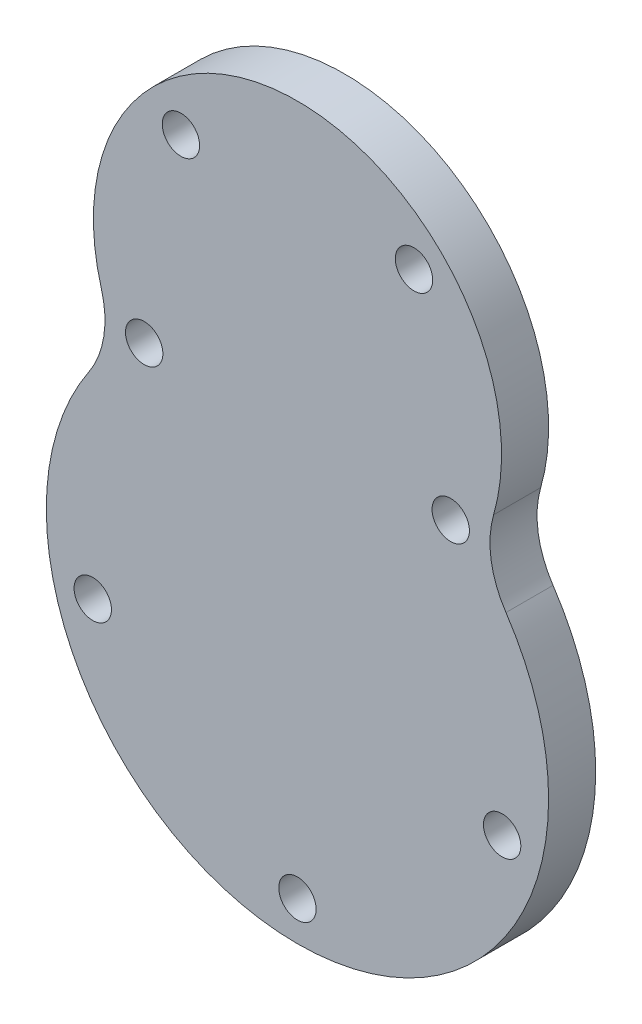
ISO-10303-21;
HEADER;
FILE_DESCRIPTION(('STEP AP214'),'2;1');
FILE_NAME('part.step','',(''),(''),'','','');
FILE_SCHEMA(('AUTOMOTIVE_DESIGN { 1 0 10303 214 1 1 1 1 }'));
ENDSEC;
DATA;
#1=APPLICATION_CONTEXT('core data for automotive mechanical design processes');
#2=APPLICATION_PROTOCOL_DEFINITION('international standard','automotive_design',2000,#1);
#3=PRODUCT_CONTEXT('',#1,'mechanical');
#4=PRODUCT('Part','Part','',(#3));
#5=PRODUCT_RELATED_PRODUCT_CATEGORY('part','',(#4));
#6=PRODUCT_DEFINITION_FORMATION('','',#4);
#7=PRODUCT_DEFINITION_CONTEXT('part definition',#1,'design');
#8=PRODUCT_DEFINITION('design','',#6,#7);
#9=PRODUCT_DEFINITION_SHAPE('','',#8);
#10=(LENGTH_UNIT() NAMED_UNIT(*) SI_UNIT(.MILLI.,.METRE.));
#11=(NAMED_UNIT(*) PLANE_ANGLE_UNIT() SI_UNIT($,.RADIAN.));
#12=(NAMED_UNIT(*) SI_UNIT($,.STERADIAN.) SOLID_ANGLE_UNIT());
#13=UNCERTAINTY_MEASURE_WITH_UNIT(LENGTH_MEASURE(1.E-05),#10,'distance_accuracy_value','');
#14=(GEOMETRIC_REPRESENTATION_CONTEXT(3) GLOBAL_UNCERTAINTY_ASSIGNED_CONTEXT((#13)) GLOBAL_UNIT_ASSIGNED_CONTEXT((#10,
#11,#12)) REPRESENTATION_CONTEXT('',''));
#15=CARTESIAN_POINT('',(0.,0.,0.));
#16=DIRECTION('',(0.,0.,1.));
#17=DIRECTION('',(1.,0.,0.));
#18=AXIS2_PLACEMENT_3D('',#15,#16,#17);
#19=CARTESIAN_POINT('',(36.528744622194,-10.4714285714286,6.));
#20=DIRECTION('',(0.,0.,-1.));
#21=DIRECTION('',(-1.,0.,0.));
#22=AXIS2_PLACEMENT_3D('',#19,#20,#21);
#23=CYLINDRICAL_SURFACE('',#22,12.);
#24=CARTESIAN_POINT('',(36.528744622194,-10.4714285714286,0.));
#25=DIRECTION('',(0.,0.,-1.));
#26=DIRECTION('',(1.,0.,0.));
#27=AXIS2_PLACEMENT_3D('',#24,#25,#26);
#28=CIRCLE('',#27,12.);
#29=CARTESIAN_POINT('',(26.566359725232,-17.161038961039,0.));
#30=VERTEX_POINT('',#29);
#31=CARTESIAN_POINT('',(24.9933515836064,-7.16466165413534,0.));
#32=VERTEX_POINT('',#31);
#33=EDGE_CURVE('E112',#30,#32,#28,.T.);
#34=ORIENTED_EDGE('',*,*,#33,.T.);
#35=DIRECTION('',(0.,0.,-1.));
#36=VECTOR('',#35,1.);
#37=CARTESIAN_POINT('',(24.9933515836064,-7.16466165413534,6.));
#38=LINE('',#37,#36);
#39=CARTESIAN_POINT('',(24.9933515836064,-7.16466165413534,6.));
#40=VERTEX_POINT('',#39);
#41=EDGE_CURVE('E11',#40,#32,#38,.T.);
#42=ORIENTED_EDGE('',*,*,#41,.F.);
#43=CARTESIAN_POINT('',(36.528744622194,-10.4714285714286,6.));
#44=DIRECTION('',(0.,0.,-1.));
#45=DIRECTION('',(1.,0.,0.));
#46=AXIS2_PLACEMENT_3D('',#43,#44,#45);
#47=CIRCLE('',#46,12.);
#48=CARTESIAN_POINT('',(26.566359725232,-17.161038961039,6.));
#49=VERTEX_POINT('',#48);
#50=EDGE_CURVE('E96',#49,#40,#47,.T.);
#51=ORIENTED_EDGE('',*,*,#50,.F.);
#52=DIRECTION('',(0.,0.,-1.));
#53=VECTOR('',#52,1.);
#54=CARTESIAN_POINT('',(26.566359725232,-17.161038961039,6.));
#55=LINE('',#54,#53);
#56=EDGE_CURVE('E108',#49,#30,#55,.T.);
#57=ORIENTED_EDGE('',*,*,#56,.T.);
#58=EDGE_LOOP('',(#34,#42,#51,#57));
#59=FACE_BOUND('',#58,.T.);
#60=ADVANCED_FACE('F44',(#59),#23,.F.);
#61=CARTESIAN_POINT('',(0.,0.,6.));
#62=DIRECTION('',(0.,0.,-1.));
#63=DIRECTION('',(-1.,0.,0.));
#64=AXIS2_PLACEMENT_3D('',#61,#62,#63);
#65=CYLINDRICAL_SURFACE('',#64,26.);
#66=CARTESIAN_POINT('',(0.,0.,0.));
#67=DIRECTION('',(0.,0.,1.));
#68=DIRECTION('',(1.,0.,0.));
#69=AXIS2_PLACEMENT_3D('',#66,#67,#68);
#70=CIRCLE('',#69,26.);
#71=CARTESIAN_POINT('',(-24.9933515836064,-7.16466165413536,0.));
#72=VERTEX_POINT('',#71);
#73=EDGE_CURVE('E101',#32,#72,#70,.T.);
#74=ORIENTED_EDGE('',*,*,#73,.T.);
#75=DIRECTION('',(0.,0.,-1.));
#76=VECTOR('',#75,1.);
#77=CARTESIAN_POINT('',(-24.9933515836064,-7.16466165413536,6.));
#78=LINE('',#77,#76);
#79=CARTESIAN_POINT('',(-24.9933515836064,-7.16466165413536,6.));
#80=VERTEX_POINT('',#79);
#81=EDGE_CURVE('E53',#80,#72,#78,.T.);
#82=ORIENTED_EDGE('',*,*,#81,.F.);
#83=CARTESIAN_POINT('',(0.,0.,6.));
#84=DIRECTION('',(0.,0.,1.));
#85=DIRECTION('',(1.,0.,0.));
#86=AXIS2_PLACEMENT_3D('',#83,#84,#85);
#87=CIRCLE('',#86,26.);
#88=EDGE_CURVE('E91',#40,#80,#87,.T.);
#89=ORIENTED_EDGE('',*,*,#88,.F.);
#90=ORIENTED_EDGE('',*,*,#41,.T.);
#91=EDGE_LOOP('',(#74,#82,#89,#90));
#92=FACE_BOUND('',#91,.T.);
#93=ADVANCED_FACE('F100',(#92),#65,.T.);
#94=CARTESIAN_POINT('',(-36.528744622194,-10.4714285714286,6.));
#95=DIRECTION('',(0.,0.,-1.));
#96=DIRECTION('',(-1.,0.,0.));
#97=AXIS2_PLACEMENT_3D('',#94,#95,#96);
#98=CYLINDRICAL_SURFACE('',#97,12.);
#99=CARTESIAN_POINT('',(-36.528744622194,-10.4714285714286,0.));
#100=DIRECTION('',(0.,0.,-1.));
#101=DIRECTION('',(-1.,0.,0.));
#102=AXIS2_PLACEMENT_3D('',#99,#100,#101);
#103=CIRCLE('',#102,12.);
#104=CARTESIAN_POINT('',(-26.566359725232,-17.161038961039,0.));
#105=VERTEX_POINT('',#104);
#106=EDGE_CURVE('E78',#72,#105,#103,.T.);
#107=ORIENTED_EDGE('',*,*,#106,.T.);
#108=DIRECTION('',(0.,0.,-1.));
#109=VECTOR('',#108,1.);
#110=CARTESIAN_POINT('',(-26.566359725232,-17.161038961039,6.));
#111=LINE('',#110,#109);
#112=CARTESIAN_POINT('',(-26.566359725232,-17.161038961039,6.));
#113=VERTEX_POINT('',#112);
#114=EDGE_CURVE('E103',#113,#105,#111,.T.);
#115=ORIENTED_EDGE('',*,*,#114,.F.);
#116=CARTESIAN_POINT('',(-36.528744622194,-10.4714285714286,6.));
#117=DIRECTION('',(0.,0.,-1.));
#118=DIRECTION('',(-1.,0.,0.));
#119=AXIS2_PLACEMENT_3D('',#116,#117,#118);
#120=CIRCLE('',#119,12.);
#121=EDGE_CURVE('E94',#80,#113,#120,.T.);
#122=ORIENTED_EDGE('',*,*,#121,.F.);
#123=ORIENTED_EDGE('',*,*,#81,.T.);
#124=EDGE_LOOP('',(#107,#115,#122,#123));
#125=FACE_BOUND('',#124,.T.);
#126=ADVANCED_FACE('F104',(#125),#98,.F.);
#127=CARTESIAN_POINT('',(0.,-35.,6.));
#128=DIRECTION('',(0.,0.,-1.));
#129=DIRECTION('',(-1.,0.,0.));
#130=AXIS2_PLACEMENT_3D('',#127,#128,#129);
#131=CYLINDRICAL_SURFACE('',#130,32.);
#132=CARTESIAN_POINT('',(0.,-35.,0.));
#133=DIRECTION('',(0.,0.,1.));
#134=DIRECTION('',(1.,0.,0.));
#135=AXIS2_PLACEMENT_3D('',#132,#133,#134);
#136=CIRCLE('',#135,32.);
#137=EDGE_CURVE('E84',#105,#30,#136,.T.);
#138=ORIENTED_EDGE('',*,*,#137,.T.);
#139=ORIENTED_EDGE('',*,*,#56,.F.);
#140=CARTESIAN_POINT('',(0.,-35.,6.));
#141=DIRECTION('',(0.,0.,1.));
#142=DIRECTION('',(1.,0.,0.));
#143=AXIS2_PLACEMENT_3D('',#140,#141,#142);
#144=CIRCLE('',#143,32.);
#145=EDGE_CURVE('E61',#113,#49,#144,.T.);
#146=ORIENTED_EDGE('',*,*,#145,.F.);
#147=ORIENTED_EDGE('',*,*,#114,.T.);
#148=EDGE_LOOP('',(#138,#139,#146,#147));
#149=FACE_BOUND('',#148,.T.);
#150=ADVANCED_FACE('F126',(#149),#131,.T.);
#151=CARTESIAN_POINT('',(18.264372311097,-22.7357142857143,6.));
#152=DIRECTION('',(0.,0.,1.));
#153=DIRECTION('',(1.,0.,0.));
#154=AXIS2_PLACEMENT_3D('',#151,#152,#153);
#155=PLANE('',#154);
#156=CARTESIAN_POINT('',(-26.0799973098048,-41.9881142177681,6.));
#157=DIRECTION('',(0.,0.,1.));
#158=DIRECTION('',(1.,0.,0.));
#159=AXIS2_PLACEMENT_3D('',#156,#157,#158);
#160=CIRCLE('',#159,2.38125);
#161=CARTESIAN_POINT('',(-23.6987473098048,-41.9881142177681,6.));
#162=VERTEX_POINT('',#161);
#163=EDGE_CURVE('E161',#162,#162,#160,.T.);
#164=ORIENTED_EDGE('',*,*,#163,.F.);
#165=EDGE_LOOP('',(#164));
#166=FACE_BOUND('',#165,.T.);
#167=CARTESIAN_POINT('',(19.528744622194,-10.4714285714286,6.));
#168=DIRECTION('',(0.,0.,1.));
#169=DIRECTION('',(1.,0.,0.));
#170=AXIS2_PLACEMENT_3D('',#167,#168,#169);
#171=CIRCLE('',#170,2.38125);
#172=CARTESIAN_POINT('',(21.909994622194,-10.4714285714286,6.));
#173=VERTEX_POINT('',#172);
#174=EDGE_CURVE('E146',#173,#173,#171,.T.);
#175=ORIENTED_EDGE('',*,*,#174,.F.);
#176=EDGE_LOOP('',(#175));
#177=FACE_BOUND('',#176,.T.);
#178=CARTESIAN_POINT('',(14.8492424049175,14.8492424049175,6.));
#179=DIRECTION('',(0.,0.,1.));
#180=DIRECTION('',(1.,0.,0.));
#181=AXIS2_PLACEMENT_3D('',#178,#179,#180);
#182=CIRCLE('',#181,2.38125);
#183=CARTESIAN_POINT('',(17.2304924049175,14.8492424049175,6.));
#184=VERTEX_POINT('',#183);
#185=EDGE_CURVE('E145',#184,#184,#182,.T.);
#186=ORIENTED_EDGE('',*,*,#185,.F.);
#187=EDGE_LOOP('',(#186));
#188=FACE_BOUND('',#187,.T.);
#189=CARTESIAN_POINT('',(-19.528744622194,-10.4714285714286,6.));
#190=DIRECTION('',(0.,0.,1.));
#191=DIRECTION('',(1.,0.,0.));
#192=AXIS2_PLACEMENT_3D('',#189,#190,#191);
#193=CIRCLE('',#192,2.38125);
#194=CARTESIAN_POINT('',(-17.147494622194,-10.4714285714286,6.));
#195=VERTEX_POINT('',#194);
#196=EDGE_CURVE('E137',#195,#195,#193,.T.);
#197=ORIENTED_EDGE('',*,*,#196,.F.);
#198=EDGE_LOOP('',(#197));
#199=FACE_BOUND('',#198,.T.);
#200=CARTESIAN_POINT('',(0.,-62.,6.));
#201=DIRECTION('',(0.,0.,1.));
#202=DIRECTION('',(1.,0.,0.));
#203=AXIS2_PLACEMENT_3D('',#200,#201,#202);
#204=CIRCLE('',#203,2.38125);
#205=CARTESIAN_POINT('',(2.38125,-62.,6.));
#206=VERTEX_POINT('',#205);
#207=EDGE_CURVE('E162',#206,#206,#204,.T.);
#208=ORIENTED_EDGE('',*,*,#207,.F.);
#209=EDGE_LOOP('',(#208));
#210=FACE_BOUND('',#209,.T.);
#211=CARTESIAN_POINT('',(26.0799973098049,-41.9881142177679,6.));
#212=DIRECTION('',(0.,0.,1.));
#213=DIRECTION('',(1.,0.,0.));
#214=AXIS2_PLACEMENT_3D('',#211,#212,#213);
#215=CIRCLE('',#214,2.38125);
#216=CARTESIAN_POINT('',(28.4612473098049,-41.9881142177679,6.));
#217=VERTEX_POINT('',#216);
#218=EDGE_CURVE('E177',#217,#217,#215,.T.);
#219=ORIENTED_EDGE('',*,*,#218,.F.);
#220=EDGE_LOOP('',(#219));
#221=FACE_BOUND('',#220,.T.);
#222=CARTESIAN_POINT('',(-14.8492424049175,14.8492424049175,6.));
#223=DIRECTION('',(0.,0.,1.));
#224=DIRECTION('',(1.,0.,0.));
#225=AXIS2_PLACEMENT_3D('',#222,#223,#224);
#226=CIRCLE('',#225,2.38124999999999);
#227=CARTESIAN_POINT('',(-12.4679924049175,14.8492424049175,6.));
#228=VERTEX_POINT('',#227);
#229=EDGE_CURVE('E133',#228,#228,#226,.T.);
#230=ORIENTED_EDGE('',*,*,#229,.F.);
#231=EDGE_LOOP('',(#230));
#232=FACE_BOUND('',#231,.T.);
#233=ORIENTED_EDGE('',*,*,#50,.T.);
#234=ORIENTED_EDGE('',*,*,#88,.T.);
#235=ORIENTED_EDGE('',*,*,#121,.T.);
#236=ORIENTED_EDGE('',*,*,#145,.T.);
#237=EDGE_LOOP('',(#233,#234,#235,#236));
#238=FACE_BOUND('',#237,.T.);
#239=ADVANCED_FACE('F92',(#166,#177,#188,#199,#210,#221,#232,#238),#155,.T.);
#240=CARTESIAN_POINT('',(18.264372311097,-22.7357142857143,0.));
#241=DIRECTION('',(0.,0.,1.));
#242=DIRECTION('',(1.,0.,0.));
#243=AXIS2_PLACEMENT_3D('',#240,#241,#242);
#244=PLANE('',#243);
#245=CARTESIAN_POINT('',(-26.0799973098048,-41.9881142177681,0.));
#246=DIRECTION('',(0.,0.,1.));
#247=DIRECTION('',(1.,0.,0.));
#248=AXIS2_PLACEMENT_3D('',#245,#246,#247);
#249=CIRCLE('',#248,2.38125);
#250=CARTESIAN_POINT('',(-23.6987473098048,-41.9881142177681,0.));
#251=VERTEX_POINT('',#250);
#252=EDGE_CURVE('E157',#251,#251,#249,.T.);
#253=ORIENTED_EDGE('',*,*,#252,.T.);
#254=EDGE_LOOP('',(#253));
#255=FACE_BOUND('',#254,.T.);
#256=CARTESIAN_POINT('',(19.528744622194,-10.4714285714286,0.));
#257=DIRECTION('',(0.,0.,1.));
#258=DIRECTION('',(1.,0.,0.));
#259=AXIS2_PLACEMENT_3D('',#256,#257,#258);
#260=CIRCLE('',#259,2.38125);
#261=CARTESIAN_POINT('',(21.909994622194,-10.4714285714286,0.));
#262=VERTEX_POINT('',#261);
#263=EDGE_CURVE('E166',#262,#262,#260,.T.);
#264=ORIENTED_EDGE('',*,*,#263,.T.);
#265=EDGE_LOOP('',(#264));
#266=FACE_BOUND('',#265,.T.);
#267=CARTESIAN_POINT('',(14.8492424049175,14.8492424049175,0.));
#268=DIRECTION('',(0.,0.,1.));
#269=DIRECTION('',(1.,0.,0.));
#270=AXIS2_PLACEMENT_3D('',#267,#268,#269);
#271=CIRCLE('',#270,2.38125);
#272=CARTESIAN_POINT('',(17.2304924049175,14.8492424049175,0.));
#273=VERTEX_POINT('',#272);
#274=EDGE_CURVE('E141',#273,#273,#271,.T.);
#275=ORIENTED_EDGE('',*,*,#274,.T.);
#276=EDGE_LOOP('',(#275));
#277=FACE_BOUND('',#276,.T.);
#278=CARTESIAN_POINT('',(-19.528744622194,-10.4714285714286,0.));
#279=DIRECTION('',(0.,0.,1.));
#280=DIRECTION('',(1.,0.,0.));
#281=AXIS2_PLACEMENT_3D('',#278,#279,#280);
#282=CIRCLE('',#281,2.38125);
#283=CARTESIAN_POINT('',(-17.147494622194,-10.4714285714286,0.));
#284=VERTEX_POINT('',#283);
#285=EDGE_CURVE('E150',#284,#284,#282,.T.);
#286=ORIENTED_EDGE('',*,*,#285,.T.);
#287=EDGE_LOOP('',(#286));
#288=FACE_BOUND('',#287,.T.);
#289=CARTESIAN_POINT('',(0.,-62.,0.));
#290=DIRECTION('',(0.,0.,1.));
#291=DIRECTION('',(1.,0.,0.));
#292=AXIS2_PLACEMENT_3D('',#289,#290,#291);
#293=CIRCLE('',#292,2.38125);
#294=CARTESIAN_POINT('',(2.38125,-62.,0.));
#295=VERTEX_POINT('',#294);
#296=EDGE_CURVE('E181',#295,#295,#293,.T.);
#297=ORIENTED_EDGE('',*,*,#296,.T.);
#298=EDGE_LOOP('',(#297));
#299=FACE_BOUND('',#298,.T.);
#300=CARTESIAN_POINT('',(26.0799973098049,-41.9881142177679,0.));
#301=DIRECTION('',(0.,0.,1.));
#302=DIRECTION('',(1.,0.,0.));
#303=AXIS2_PLACEMENT_3D('',#300,#301,#302);
#304=CIRCLE('',#303,2.38125);
#305=CARTESIAN_POINT('',(28.4612473098049,-41.9881142177679,0.));
#306=VERTEX_POINT('',#305);
#307=EDGE_CURVE('E173',#306,#306,#304,.T.);
#308=ORIENTED_EDGE('',*,*,#307,.T.);
#309=EDGE_LOOP('',(#308));
#310=FACE_BOUND('',#309,.T.);
#311=CARTESIAN_POINT('',(-14.8492424049175,14.8492424049175,0.));
#312=DIRECTION('',(0.,0.,1.));
#313=DIRECTION('',(1.,0.,0.));
#314=AXIS2_PLACEMENT_3D('',#311,#312,#313);
#315=CIRCLE('',#314,2.38124999999999);
#316=CARTESIAN_POINT('',(-12.4679924049175,14.8492424049175,0.));
#317=VERTEX_POINT('',#316);
#318=EDGE_CURVE('E116',#317,#317,#315,.T.);
#319=ORIENTED_EDGE('',*,*,#318,.T.);
#320=EDGE_LOOP('',(#319));
#321=FACE_BOUND('',#320,.T.);
#322=ORIENTED_EDGE('',*,*,#33,.F.);
#323=ORIENTED_EDGE('',*,*,#137,.F.);
#324=ORIENTED_EDGE('',*,*,#106,.F.);
#325=ORIENTED_EDGE('',*,*,#73,.F.);
#326=EDGE_LOOP('',(#322,#323,#324,#325));
#327=FACE_BOUND('',#326,.T.);
#328=ADVANCED_FACE('F129',(#255,#266,#277,#288,#299,#310,#321,#327),#244,.F.);
#329=CARTESIAN_POINT('',(-14.8492424049175,14.8492424049175,0.));
#330=DIRECTION('',(0.,0.,1.));
#331=DIRECTION('',(1.,0.,0.));
#332=AXIS2_PLACEMENT_3D('',#329,#330,#331);
#333=CYLINDRICAL_SURFACE('',#332,2.38124999999999);
#334=ORIENTED_EDGE('',*,*,#318,.F.);
#335=EDGE_LOOP('',(#334));
#336=FACE_BOUND('',#335,.T.);
#337=ORIENTED_EDGE('',*,*,#229,.T.);
#338=EDGE_LOOP('',(#337));
#339=FACE_BOUND('',#338,.T.);
#340=ADVANCED_FACE('F199',(#336,#339),#333,.F.);
#341=CARTESIAN_POINT('',(26.0799973098049,-41.9881142177679,0.));
#342=DIRECTION('',(0.,0.,1.));
#343=DIRECTION('',(1.,0.,0.));
#344=AXIS2_PLACEMENT_3D('',#341,#342,#343);
#345=CYLINDRICAL_SURFACE('',#344,2.38125);
#346=ORIENTED_EDGE('',*,*,#307,.F.);
#347=EDGE_LOOP('',(#346));
#348=FACE_BOUND('',#347,.T.);
#349=ORIENTED_EDGE('',*,*,#218,.T.);
#350=EDGE_LOOP('',(#349));
#351=FACE_BOUND('',#350,.T.);
#352=ADVANCED_FACE('F201',(#348,#351),#345,.F.);
#353=CARTESIAN_POINT('',(0.,-62.,0.));
#354=DIRECTION('',(0.,0.,1.));
#355=DIRECTION('',(1.,0.,0.));
#356=AXIS2_PLACEMENT_3D('',#353,#354,#355);
#357=CYLINDRICAL_SURFACE('',#356,2.38125);
#358=ORIENTED_EDGE('',*,*,#296,.F.);
#359=EDGE_LOOP('',(#358));
#360=FACE_BOUND('',#359,.T.);
#361=ORIENTED_EDGE('',*,*,#207,.T.);
#362=EDGE_LOOP('',(#361));
#363=FACE_BOUND('',#362,.T.);
#364=ADVANCED_FACE('F189',(#360,#363),#357,.F.);
#365=CARTESIAN_POINT('',(-19.528744622194,-10.4714285714286,0.));
#366=DIRECTION('',(0.,0.,1.));
#367=DIRECTION('',(1.,0.,0.));
#368=AXIS2_PLACEMENT_3D('',#365,#366,#367);
#369=CYLINDRICAL_SURFACE('',#368,2.38125);
#370=ORIENTED_EDGE('',*,*,#285,.F.);
#371=EDGE_LOOP('',(#370));
#372=FACE_BOUND('',#371,.T.);
#373=ORIENTED_EDGE('',*,*,#196,.T.);
#374=EDGE_LOOP('',(#373));
#375=FACE_BOUND('',#374,.T.);
#376=ADVANCED_FACE('F255',(#372,#375),#369,.F.);
#377=CARTESIAN_POINT('',(14.8492424049175,14.8492424049175,0.));
#378=DIRECTION('',(0.,0.,1.));
#379=DIRECTION('',(1.,0.,0.));
#380=AXIS2_PLACEMENT_3D('',#377,#378,#379);
#381=CYLINDRICAL_SURFACE('',#380,2.38125);
#382=ORIENTED_EDGE('',*,*,#274,.F.);
#383=EDGE_LOOP('',(#382));
#384=FACE_BOUND('',#383,.T.);
#385=ORIENTED_EDGE('',*,*,#185,.T.);
#386=EDGE_LOOP('',(#385));
#387=FACE_BOUND('',#386,.T.);
#388=ADVANCED_FACE('F265',(#384,#387),#381,.F.);
#389=CARTESIAN_POINT('',(19.528744622194,-10.4714285714286,0.));
#390=DIRECTION('',(0.,0.,1.));
#391=DIRECTION('',(1.,0.,0.));
#392=AXIS2_PLACEMENT_3D('',#389,#390,#391);
#393=CYLINDRICAL_SURFACE('',#392,2.38125);
#394=ORIENTED_EDGE('',*,*,#263,.F.);
#395=EDGE_LOOP('',(#394));
#396=FACE_BOUND('',#395,.T.);
#397=ORIENTED_EDGE('',*,*,#174,.T.);
#398=EDGE_LOOP('',(#397));
#399=FACE_BOUND('',#398,.T.);
#400=ADVANCED_FACE('F275',(#396,#399),#393,.F.);
#401=CARTESIAN_POINT('',(-26.0799973098048,-41.9881142177681,0.));
#402=DIRECTION('',(0.,0.,1.));
#403=DIRECTION('',(1.,0.,0.));
#404=AXIS2_PLACEMENT_3D('',#401,#402,#403);
#405=CYLINDRICAL_SURFACE('',#404,2.38125);
#406=ORIENTED_EDGE('',*,*,#252,.F.);
#407=EDGE_LOOP('',(#406));
#408=FACE_BOUND('',#407,.T.);
#409=ORIENTED_EDGE('',*,*,#163,.T.);
#410=EDGE_LOOP('',(#409));
#411=FACE_BOUND('',#410,.T.);
#412=ADVANCED_FACE('F284',(#408,#411),#405,.F.);
#413=CLOSED_SHELL('',(#60,#93,#126,#150,#239,#328,#340,#352,#364,#376,#388,#400,#412));
#414=MANIFOLD_SOLID_BREP('B2',#413);
#415=ADVANCED_BREP_SHAPE_REPRESENTATION('',(#18,#414),#14);
#416=SHAPE_DEFINITION_REPRESENTATION(#9,#415);
ENDSEC;
END-ISO-10303-21;
